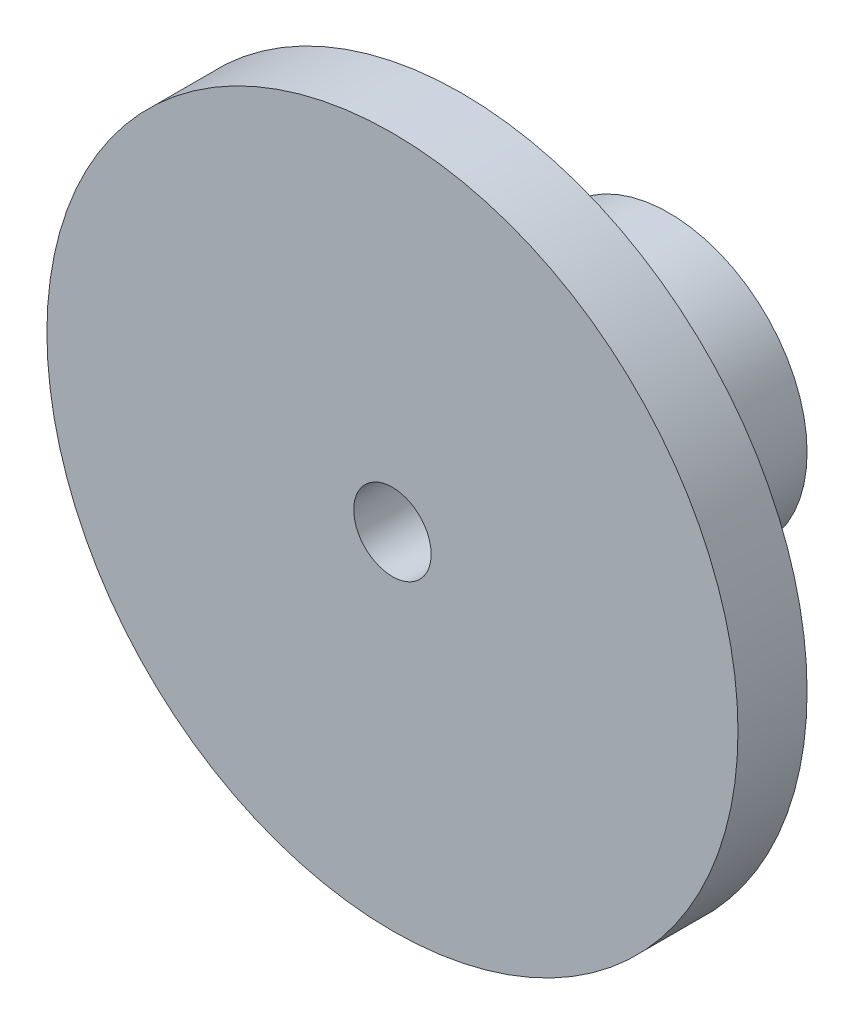
ISO-10303-21;
HEADER;
FILE_DESCRIPTION(('STEP AP214'),'2;1');
FILE_NAME('part.step','',(''),(''),'','','');
FILE_SCHEMA(('AUTOMOTIVE_DESIGN { 1 0 10303 214 1 1 1 1 }'));
ENDSEC;
DATA;
#1=APPLICATION_CONTEXT('core data for automotive mechanical design processes');
#2=APPLICATION_PROTOCOL_DEFINITION('international standard','automotive_design',2000,#1);
#3=PRODUCT_CONTEXT('',#1,'mechanical');
#4=PRODUCT('Part','Part','',(#3));
#5=PRODUCT_RELATED_PRODUCT_CATEGORY('part','',(#4));
#6=PRODUCT_DEFINITION_FORMATION('','',#4);
#7=PRODUCT_DEFINITION_CONTEXT('part definition',#1,'design');
#8=PRODUCT_DEFINITION('design','',#6,#7);
#9=PRODUCT_DEFINITION_SHAPE('','',#8);
#10=(LENGTH_UNIT() NAMED_UNIT(*) SI_UNIT(.MILLI.,.METRE.));
#11=(NAMED_UNIT(*) PLANE_ANGLE_UNIT() SI_UNIT($,.RADIAN.));
#12=(NAMED_UNIT(*) SI_UNIT($,.STERADIAN.) SOLID_ANGLE_UNIT());
#13=UNCERTAINTY_MEASURE_WITH_UNIT(LENGTH_MEASURE(1.E-05),#10,'distance_accuracy_value','');
#14=(GEOMETRIC_REPRESENTATION_CONTEXT(3) GLOBAL_UNCERTAINTY_ASSIGNED_CONTEXT((#13)) GLOBAL_UNIT_ASSIGNED_CONTEXT((#10,
#11,#12)) REPRESENTATION_CONTEXT('',''));
#15=CARTESIAN_POINT('',(0.,0.,0.));
#16=DIRECTION('',(0.,0.,1.));
#17=DIRECTION('',(1.,0.,0.));
#18=AXIS2_PLACEMENT_3D('',#15,#16,#17);
#19=CARTESIAN_POINT('',(0.,0.,0.));
#20=DIRECTION('',(0.,0.,1.));
#21=DIRECTION('',(1.,0.,0.));
#22=AXIS2_PLACEMENT_3D('',#19,#20,#21);
#23=PLANE('',#22);
#24=CARTESIAN_POINT('',(0.,0.,0.));
#25=DIRECTION('',(0.,0.,1.));
#26=DIRECTION('',(1.,0.,0.));
#27=AXIS2_PLACEMENT_3D('',#24,#25,#26);
#28=CIRCLE('',#27,25.);
#29=CARTESIAN_POINT('',(25.,0.,0.));
#30=VERTEX_POINT('',#29);
#31=EDGE_CURVE('E46',#30,#30,#28,.T.);
#32=ORIENTED_EDGE('',*,*,#31,.F.);
#33=EDGE_LOOP('',(#32));
#34=FACE_BOUND('',#33,.T.);
#35=CARTESIAN_POINT('',(0.,0.,0.));
#36=DIRECTION('',(0.,0.,1.));
#37=DIRECTION('',(1.,0.,0.));
#38=AXIS2_PLACEMENT_3D('',#35,#36,#37);
#39=CIRCLE('',#38,10.);
#40=CARTESIAN_POINT('',(10.,0.,0.));
#41=VERTEX_POINT('',#40);
#42=EDGE_CURVE('E10',#41,#41,#39,.F.);
#43=ORIENTED_EDGE('',*,*,#42,.F.);
#44=EDGE_LOOP('',(#43));
#45=FACE_BOUND('',#44,.T.);
#46=ADVANCED_FACE('F35',(#34,#45),#23,.F.);
#47=CARTESIAN_POINT('',(0.,0.,5.));
#48=DIRECTION('',(0.,0.,1.));
#49=DIRECTION('',(1.,0.,0.));
#50=AXIS2_PLACEMENT_3D('',#47,#48,#49);
#51=PLANE('',#50);
#52=CARTESIAN_POINT('',(0.,0.,5.));
#53=DIRECTION('',(0.,0.,1.));
#54=DIRECTION('',(1.,0.,0.));
#55=AXIS2_PLACEMENT_3D('',#52,#53,#54);
#56=CIRCLE('',#55,25.);
#57=CARTESIAN_POINT('',(25.,0.,5.));
#58=VERTEX_POINT('',#57);
#59=EDGE_CURVE('E42',#58,#58,#56,.T.);
#60=ORIENTED_EDGE('',*,*,#59,.T.);
#61=EDGE_LOOP('',(#60));
#62=FACE_BOUND('',#61,.T.);
#63=CARTESIAN_POINT('',(0.,0.,5.));
#64=DIRECTION('',(0.,0.,1.));
#65=DIRECTION('',(1.,0.,0.));
#66=AXIS2_PLACEMENT_3D('',#63,#64,#65);
#67=CIRCLE('',#66,2.8);
#68=CARTESIAN_POINT('',(2.8,0.,5.));
#69=VERTEX_POINT('',#68);
#70=EDGE_CURVE('E51',#69,#69,#67,.T.);
#71=ORIENTED_EDGE('',*,*,#70,.F.);
#72=EDGE_LOOP('',(#71));
#73=FACE_BOUND('',#72,.T.);
#74=ADVANCED_FACE('F78',(#62,#73),#51,.T.);
#75=CARTESIAN_POINT('',(0.,0.,5.));
#76=DIRECTION('',(0.,0.,-1.));
#77=DIRECTION('',(-1.,0.,0.));
#78=AXIS2_PLACEMENT_3D('',#75,#76,#77);
#79=CYLINDRICAL_SURFACE('',#78,25.);
#80=ORIENTED_EDGE('',*,*,#59,.F.);
#81=EDGE_LOOP('',(#80));
#82=FACE_BOUND('',#81,.T.);
#83=ORIENTED_EDGE('',*,*,#31,.T.);
#84=EDGE_LOOP('',(#83));
#85=FACE_BOUND('',#84,.T.);
#86=ADVANCED_FACE('F37',(#82,#85),#79,.T.);
#87=CARTESIAN_POINT('',(0.,0.,5.));
#88=DIRECTION('',(0.,0.,-1.));
#89=DIRECTION('',(-1.,0.,0.));
#90=AXIS2_PLACEMENT_3D('',#87,#88,#89);
#91=CYLINDRICAL_SURFACE('',#90,2.8);
#92=ORIENTED_EDGE('',*,*,#70,.T.);
#93=EDGE_LOOP('',(#92));
#94=FACE_BOUND('',#93,.T.);
#95=CARTESIAN_POINT('',(0.,0.,-15.));
#96=DIRECTION('',(0.,0.,-1.));
#97=DIRECTION('',(-1.,0.,0.));
#98=AXIS2_PLACEMENT_3D('',#95,#96,#97);
#99=CIRCLE('',#98,2.8);
#100=CARTESIAN_POINT('',(-2.8,0.,-15.));
#101=VERTEX_POINT('',#100);
#102=EDGE_CURVE('E58',#101,#101,#99,.T.);
#103=ORIENTED_EDGE('',*,*,#102,.T.);
#104=EDGE_LOOP('',(#103));
#105=FACE_BOUND('',#104,.T.);
#106=ADVANCED_FACE('F62',(#94,#105),#91,.F.);
#107=CARTESIAN_POINT('',(0.,0.,-15.));
#108=DIRECTION('',(0.,0.,-1.));
#109=DIRECTION('',(-1.,0.,0.));
#110=AXIS2_PLACEMENT_3D('',#107,#108,#109);
#111=PLANE('',#110);
#112=CARTESIAN_POINT('',(0.,0.,-15.));
#113=DIRECTION('',(0.,0.,-1.));
#114=DIRECTION('',(-1.,0.,0.));
#115=AXIS2_PLACEMENT_3D('',#112,#113,#114);
#116=CIRCLE('',#115,10.);
#117=CARTESIAN_POINT('',(-10.,0.,-15.));
#118=VERTEX_POINT('',#117);
#119=EDGE_CURVE('E55',#118,#118,#116,.T.);
#120=ORIENTED_EDGE('',*,*,#119,.T.);
#121=EDGE_LOOP('',(#120));
#122=FACE_BOUND('',#121,.T.);
#123=ORIENTED_EDGE('',*,*,#102,.F.);
#124=EDGE_LOOP('',(#123));
#125=FACE_BOUND('',#124,.T.);
#126=ADVANCED_FACE('F64',(#122,#125),#111,.T.);
#127=CARTESIAN_POINT('',(0.,0.,-15.));
#128=DIRECTION('',(0.,0.,1.));
#129=DIRECTION('',(1.,0.,0.));
#130=AXIS2_PLACEMENT_3D('',#127,#128,#129);
#131=CYLINDRICAL_SURFACE('',#130,10.);
#132=ORIENTED_EDGE('',*,*,#119,.F.);
#133=EDGE_LOOP('',(#132));
#134=FACE_BOUND('',#133,.T.);
#135=ORIENTED_EDGE('',*,*,#42,.T.);
#136=EDGE_LOOP('',(#135));
#137=FACE_BOUND('',#136,.T.);
#138=ADVANCED_FACE('F66',(#134,#137),#131,.T.);
#139=CLOSED_SHELL('',(#46,#74,#86,#106,#126,#138));
#140=MANIFOLD_SOLID_BREP('B2',#139);
#141=ADVANCED_BREP_SHAPE_REPRESENTATION('',(#18,#140),#14);
#142=SHAPE_DEFINITION_REPRESENTATION(#9,#141);
ENDSEC;
END-ISO-10303-21;
